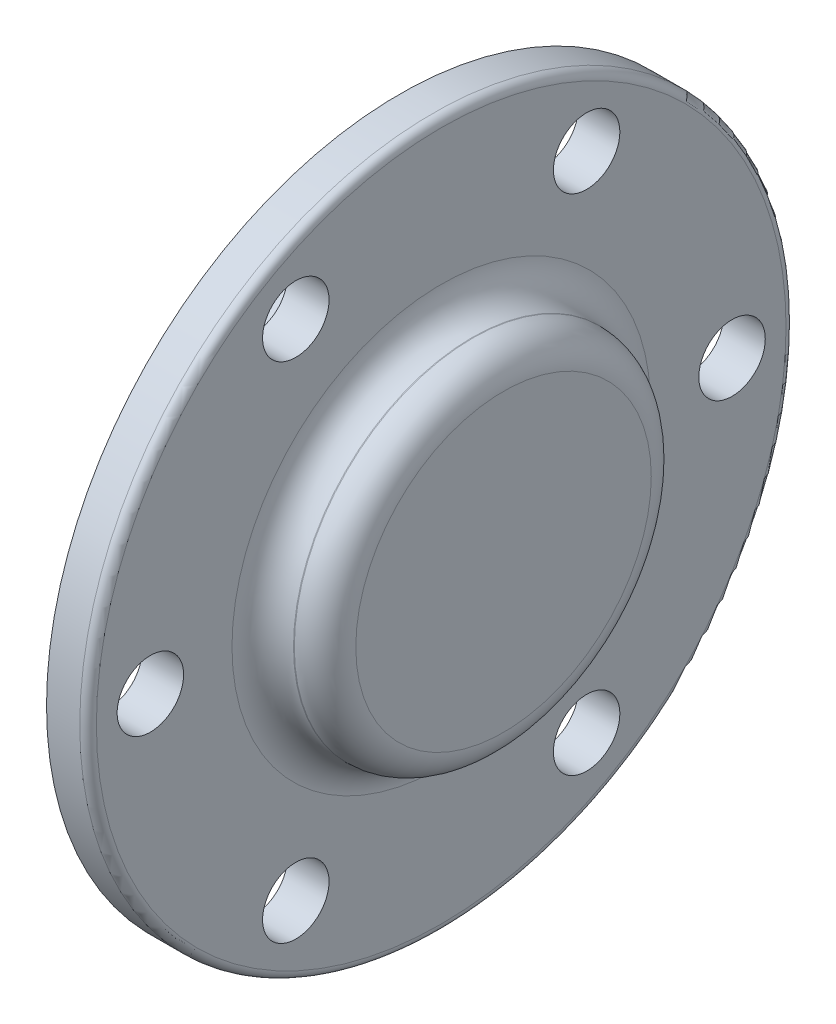
ISO-10303-21;
HEADER;
FILE_DESCRIPTION(('STEP AP214'),'2;1');
FILE_NAME('part.step','',(''),(''),'','','');
FILE_SCHEMA(('AUTOMOTIVE_DESIGN { 1 0 10303 214 1 1 1 1 }'));
ENDSEC;
DATA;
#1=APPLICATION_CONTEXT('core data for automotive mechanical design processes');
#2=APPLICATION_PROTOCOL_DEFINITION('international standard','automotive_design',2000,#1);
#3=PRODUCT_CONTEXT('',#1,'mechanical');
#4=PRODUCT('Part','Part','',(#3));
#5=PRODUCT_RELATED_PRODUCT_CATEGORY('part','',(#4));
#6=PRODUCT_DEFINITION_FORMATION('','',#4);
#7=PRODUCT_DEFINITION_CONTEXT('part definition',#1,'design');
#8=PRODUCT_DEFINITION('design','',#6,#7);
#9=PRODUCT_DEFINITION_SHAPE('','',#8);
#10=(LENGTH_UNIT() NAMED_UNIT(*) SI_UNIT(.MILLI.,.METRE.));
#11=(NAMED_UNIT(*) PLANE_ANGLE_UNIT() SI_UNIT($,.RADIAN.));
#12=(NAMED_UNIT(*) SI_UNIT($,.STERADIAN.) SOLID_ANGLE_UNIT());
#13=UNCERTAINTY_MEASURE_WITH_UNIT(LENGTH_MEASURE(1.E-05),#10,'distance_accuracy_value','');
#14=(GEOMETRIC_REPRESENTATION_CONTEXT(3) GLOBAL_UNCERTAINTY_ASSIGNED_CONTEXT((#13)) GLOBAL_UNIT_ASSIGNED_CONTEXT((#10,
#11,#12)) REPRESENTATION_CONTEXT('',''));
#15=CARTESIAN_POINT('',(0.,0.,0.));
#16=DIRECTION('',(0.,0.,1.));
#17=DIRECTION('',(1.,0.,0.));
#18=AXIS2_PLACEMENT_3D('',#15,#16,#17);
#19=CARTESIAN_POINT('',(38.,0.,0.));
#20=DIRECTION('',(1.,0.,0.));
#21=DIRECTION('',(0.,0.,-1.));
#22=AXIS2_PLACEMENT_3D('',#19,#20,#21);
#23=PLANE('',#22);
#24=CARTESIAN_POINT('',(38.,0.,0.));
#25=DIRECTION('',(-1.,0.,0.));
#26=DIRECTION('',(0.,0.,1.));
#27=AXIS2_PLACEMENT_3D('',#24,#25,#26);
#28=CIRCLE('',#27,23.139710976573);
#29=CARTESIAN_POINT('',(38.,0.,23.139710976573));
#30=VERTEX_POINT('',#29);
#31=EDGE_CURVE('E70',#30,#30,#28,.T.);
#32=ORIENTED_EDGE('',*,*,#31,.T.);
#33=EDGE_LOOP('',(#32));
#34=FACE_BOUND('',#33,.T.);
#35=ADVANCED_FACE('F37',(#34),#23,.F.);
#36=CARTESIAN_POINT('',(48.,0.,0.));
#37=DIRECTION('',(1.,0.,0.));
#38=DIRECTION('',(0.,0.,-1.));
#39=AXIS2_PLACEMENT_3D('',#36,#37,#38);
#40=PLANE('',#39);
#41=CARTESIAN_POINT('',(48.,0.,0.));
#42=DIRECTION('',(-1.,0.,0.));
#43=DIRECTION('',(0.,0.,1.));
#44=AXIS2_PLACEMENT_3D('',#41,#42,#43);
#45=CIRCLE('',#44,35.5600663113483);
#46=CARTESIAN_POINT('',(48.,0.,35.5600663113483));
#47=VERTEX_POINT('',#46);
#48=EDGE_CURVE('E10',#47,#47,#45,.T.);
#49=ORIENTED_EDGE('',*,*,#48,.F.);
#50=EDGE_LOOP('',(#49));
#51=FACE_BOUND('',#50,.T.);
#52=ADVANCED_FACE('F121',(#51),#40,.T.);
#53=CARTESIAN_POINT('',(40.6,0.,0.));
#54=DIRECTION('',(-1.,0.,0.));
#55=DIRECTION('',(0.,0.,1.));
#56=AXIS2_PLACEMENT_3D('',#53,#54,#55);
#57=TOROIDAL_SURFACE('',#56,35.5600663113483,7.4);
#58=ORIENTED_EDGE('',*,*,#48,.T.);
#59=EDGE_LOOP('',(#58));
#60=FACE_BOUND('',#59,.T.);
#61=CARTESIAN_POINT('',(40.6,0.,0.));
#62=DIRECTION('',(-1.,0.,0.));
#63=DIRECTION('',(0.,0.,1.));
#64=AXIS2_PLACEMENT_3D('',#61,#62,#63);
#65=CIRCLE('',#64,42.9600663113483);
#66=CARTESIAN_POINT('',(40.6,0.,42.9600663113483));
#67=VERTEX_POINT('',#66);
#68=EDGE_CURVE('E44',#67,#67,#65,.T.);
#69=ORIENTED_EDGE('',*,*,#68,.F.);
#70=EDGE_LOOP('',(#69));
#71=FACE_BOUND('',#70,.T.);
#72=ADVANCED_FACE('F112',(#60,#71),#57,.T.);
#73=CARTESIAN_POINT('',(0.,0.,0.));
#74=DIRECTION('',(-1.,0.,0.));
#75=DIRECTION('',(0.,0.,1.));
#76=AXIS2_PLACEMENT_3D('',#73,#74,#75);
#77=CYLINDRICAL_SURFACE('',#76,42.9600663113483);
#78=ORIENTED_EDGE('',*,*,#68,.T.);
#79=EDGE_LOOP('',(#78));
#80=FACE_BOUND('',#79,.T.);
#81=CARTESIAN_POINT('',(40.4,0.,0.));
#82=DIRECTION('',(-1.,0.,0.));
#83=DIRECTION('',(0.,0.,1.));
#84=AXIS2_PLACEMENT_3D('',#81,#82,#83);
#85=CIRCLE('',#84,42.9600663113483);
#86=CARTESIAN_POINT('',(40.4,0.,42.9600663113483));
#87=VERTEX_POINT('',#86);
#88=EDGE_CURVE('E49',#87,#87,#85,.T.);
#89=ORIENTED_EDGE('',*,*,#88,.F.);
#90=EDGE_LOOP('',(#89));
#91=FACE_BOUND('',#90,.T.);
#92=ADVANCED_FACE('F110',(#80,#91),#77,.T.);
#93=CARTESIAN_POINT('',(40.4,0.,0.));
#94=DIRECTION('',(-1.,0.,0.));
#95=DIRECTION('',(0.,0.,1.));
#96=AXIS2_PLACEMENT_3D('',#93,#94,#95);
#97=TOROIDAL_SURFACE('',#96,50.3600663113483,7.40000000000001);
#98=ORIENTED_EDGE('',*,*,#88,.T.);
#99=EDGE_LOOP('',(#98));
#100=FACE_BOUND('',#99,.T.);
#101=CARTESIAN_POINT('',(33.,0.,0.));
#102=DIRECTION('',(-1.,0.,0.));
#103=DIRECTION('',(0.,0.,1.));
#104=AXIS2_PLACEMENT_3D('',#101,#102,#103);
#105=CIRCLE('',#104,50.3600663113483);
#106=CARTESIAN_POINT('',(33.,0.,50.3600663113483));
#107=VERTEX_POINT('',#106);
#108=EDGE_CURVE('E102',#107,#107,#105,.T.);
#109=ORIENTED_EDGE('',*,*,#108,.F.);
#110=EDGE_LOOP('',(#109));
#111=FACE_BOUND('',#110,.T.);
#112=ADVANCED_FACE('F107',(#100,#111),#97,.F.);
#113=CARTESIAN_POINT('',(33.,0.,0.));
#114=DIRECTION('',(1.,0.,0.));
#115=DIRECTION('',(0.,0.,-1.));
#116=AXIS2_PLACEMENT_3D('',#113,#114,#115);
#117=PLANE('',#116);
#118=CARTESIAN_POINT('',(33.,0.,-70.));
#119=DIRECTION('',(1.,0.,0.));
#120=DIRECTION('',(0.,0.,-1.));
#121=AXIS2_PLACEMENT_3D('',#118,#119,#120);
#122=CIRCLE('',#121,8.);
#123=CARTESIAN_POINT('',(33.,0.,-78.));
#124=VERTEX_POINT('',#123);
#125=EDGE_CURVE('E57',#124,#124,#122,.T.);
#126=ORIENTED_EDGE('',*,*,#125,.F.);
#127=EDGE_LOOP('',(#126));
#128=FACE_BOUND('',#127,.T.);
#129=CARTESIAN_POINT('',(33.,60.6217782649107,-35.));
#130=DIRECTION('',(1.,0.,0.));
#131=DIRECTION('',(0.,0.,-1.));
#132=AXIS2_PLACEMENT_3D('',#129,#130,#131);
#133=CIRCLE('',#132,7.99999999999998);
#134=CARTESIAN_POINT('',(33.,60.6217782649107,-43.));
#135=VERTEX_POINT('',#134);
#136=EDGE_CURVE('E338',#135,#135,#133,.T.);
#137=ORIENTED_EDGE('',*,*,#136,.F.);
#138=EDGE_LOOP('',(#137));
#139=FACE_BOUND('',#138,.T.);
#140=CARTESIAN_POINT('',(33.,60.6217782649107,35.));
#141=DIRECTION('',(1.,0.,0.));
#142=DIRECTION('',(0.,0.,-1.));
#143=AXIS2_PLACEMENT_3D('',#140,#141,#142);
#144=CIRCLE('',#143,7.99999999999999);
#145=CARTESIAN_POINT('',(33.,60.6217782649107,27.));
#146=VERTEX_POINT('',#145);
#147=EDGE_CURVE('E82',#146,#146,#144,.T.);
#148=ORIENTED_EDGE('',*,*,#147,.F.);
#149=EDGE_LOOP('',(#148));
#150=FACE_BOUND('',#149,.T.);
#151=CARTESIAN_POINT('',(33.,0.,70.));
#152=DIRECTION('',(1.,0.,0.));
#153=DIRECTION('',(0.,0.,-1.));
#154=AXIS2_PLACEMENT_3D('',#151,#152,#153);
#155=CIRCLE('',#154,7.99999999999999);
#156=CARTESIAN_POINT('',(33.,0.,62.));
#157=VERTEX_POINT('',#156);
#158=EDGE_CURVE('E342',#157,#157,#155,.T.);
#159=ORIENTED_EDGE('',*,*,#158,.F.);
#160=EDGE_LOOP('',(#159));
#161=FACE_BOUND('',#160,.T.);
#162=CARTESIAN_POINT('',(33.,-60.6217782649107,35.));
#163=DIRECTION('',(1.,0.,0.));
#164=DIRECTION('',(0.,0.,-1.));
#165=AXIS2_PLACEMENT_3D('',#162,#163,#164);
#166=CIRCLE('',#165,8.);
#167=CARTESIAN_POINT('',(33.,-60.6217782649107,27.));
#168=VERTEX_POINT('',#167);
#169=EDGE_CURVE('E335',#168,#168,#166,.T.);
#170=ORIENTED_EDGE('',*,*,#169,.F.);
#171=EDGE_LOOP('',(#170));
#172=FACE_BOUND('',#171,.T.);
#173=CARTESIAN_POINT('',(33.,-60.6217782649107,-35.));
#174=DIRECTION('',(1.,0.,0.));
#175=DIRECTION('',(0.,0.,-1.));
#176=AXIS2_PLACEMENT_3D('',#173,#174,#175);
#177=CIRCLE('',#176,8.00000000000001);
#178=CARTESIAN_POINT('',(33.,-60.6217782649107,-43.));
#179=VERTEX_POINT('',#178);
#180=EDGE_CURVE('E332',#179,#179,#177,.T.);
#181=ORIENTED_EDGE('',*,*,#180,.F.);
#182=EDGE_LOOP('',(#181));
#183=FACE_BOUND('',#182,.T.);
#184=ORIENTED_EDGE('',*,*,#108,.T.);
#185=EDGE_LOOP('',(#184));
#186=FACE_BOUND('',#185,.T.);
#187=CARTESIAN_POINT('',(33.,0.,0.));
#188=DIRECTION('',(-1.,0.,0.));
#189=DIRECTION('',(0.,0.,1.));
#190=AXIS2_PLACEMENT_3D('',#187,#188,#189);
#191=CIRCLE('',#190,83.);
#192=CARTESIAN_POINT('',(33.,0.,83.));
#193=VERTEX_POINT('',#192);
#194=EDGE_CURVE('E99',#193,#193,#191,.T.);
#195=ORIENTED_EDGE('',*,*,#194,.F.);
#196=EDGE_LOOP('',(#195));
#197=FACE_BOUND('',#196,.T.);
#198=ADVANCED_FACE('F119',(#128,#139,#150,#161,#172,#183,#186,#197),#117,.T.);
#199=CARTESIAN_POINT('',(31.,0.,0.));
#200=DIRECTION('',(-1.,0.,0.));
#201=DIRECTION('',(0.,0.,1.));
#202=AXIS2_PLACEMENT_3D('',#199,#200,#201);
#203=TOROIDAL_SURFACE('',#202,83.,2.);
#204=ORIENTED_EDGE('',*,*,#194,.T.);
#205=EDGE_LOOP('',(#204));
#206=FACE_BOUND('',#205,.T.);
#207=CARTESIAN_POINT('',(31.,0.,0.));
#208=DIRECTION('',(-1.,0.,0.));
#209=DIRECTION('',(0.,0.,1.));
#210=AXIS2_PLACEMENT_3D('',#207,#208,#209);
#211=CIRCLE('',#210,85.);
#212=CARTESIAN_POINT('',(31.,0.,85.));
#213=VERTEX_POINT('',#212);
#214=EDGE_CURVE('E96',#213,#213,#211,.T.);
#215=ORIENTED_EDGE('',*,*,#214,.F.);
#216=EDGE_LOOP('',(#215));
#217=FACE_BOUND('',#216,.T.);
#218=ADVANCED_FACE('F154',(#206,#217),#203,.T.);
#219=CARTESIAN_POINT('',(0.,0.,0.));
#220=DIRECTION('',(-1.,0.,0.));
#221=DIRECTION('',(0.,0.,1.));
#222=AXIS2_PLACEMENT_3D('',#219,#220,#221);
#223=CYLINDRICAL_SURFACE('',#222,85.);
#224=ORIENTED_EDGE('',*,*,#214,.T.);
#225=EDGE_LOOP('',(#224));
#226=FACE_BOUND('',#225,.T.);
#227=CARTESIAN_POINT('',(23.,0.,0.));
#228=DIRECTION('',(-1.,0.,0.));
#229=DIRECTION('',(0.,0.,1.));
#230=AXIS2_PLACEMENT_3D('',#227,#228,#229);
#231=CIRCLE('',#230,85.);
#232=CARTESIAN_POINT('',(23.,0.,85.));
#233=VERTEX_POINT('',#232);
#234=EDGE_CURVE('E93',#233,#233,#231,.T.);
#235=ORIENTED_EDGE('',*,*,#234,.F.);
#236=EDGE_LOOP('',(#235));
#237=FACE_BOUND('',#236,.T.);
#238=ADVANCED_FACE('F159',(#226,#237),#223,.T.);
#239=CARTESIAN_POINT('',(23.,0.,0.));
#240=DIRECTION('',(-1.,0.,0.));
#241=DIRECTION('',(0.,0.,1.));
#242=AXIS2_PLACEMENT_3D('',#239,#240,#241);
#243=PLANE('',#242);
#244=CARTESIAN_POINT('',(23.,0.,-70.));
#245=DIRECTION('',(-1.,0.,0.));
#246=DIRECTION('',(0.,0.,1.));
#247=AXIS2_PLACEMENT_3D('',#244,#245,#246);
#248=CIRCLE('',#247,8.);
#249=CARTESIAN_POINT('',(23.,0.,-62.));
#250=VERTEX_POINT('',#249);
#251=EDGE_CURVE('E40',#250,#250,#248,.T.);
#252=ORIENTED_EDGE('',*,*,#251,.F.);
#253=EDGE_LOOP('',(#252));
#254=FACE_BOUND('',#253,.T.);
#255=CARTESIAN_POINT('',(23.,60.6217782649107,-35.));
#256=DIRECTION('',(-1.,0.,0.));
#257=DIRECTION('',(0.,0.,1.));
#258=AXIS2_PLACEMENT_3D('',#255,#256,#257);
#259=CIRCLE('',#258,7.99999999999998);
#260=CARTESIAN_POINT('',(23.,60.6217782649107,-27.));
#261=VERTEX_POINT('',#260);
#262=EDGE_CURVE('E65',#261,#261,#259,.T.);
#263=ORIENTED_EDGE('',*,*,#262,.F.);
#264=EDGE_LOOP('',(#263));
#265=FACE_BOUND('',#264,.T.);
#266=CARTESIAN_POINT('',(23.,60.6217782649107,35.));
#267=DIRECTION('',(-1.,0.,0.));
#268=DIRECTION('',(0.,0.,1.));
#269=AXIS2_PLACEMENT_3D('',#266,#267,#268);
#270=CIRCLE('',#269,7.99999999999999);
#271=CARTESIAN_POINT('',(23.,60.6217782649107,43.));
#272=VERTEX_POINT('',#271);
#273=EDGE_CURVE('E63',#272,#272,#270,.T.);
#274=ORIENTED_EDGE('',*,*,#273,.F.);
#275=EDGE_LOOP('',(#274));
#276=FACE_BOUND('',#275,.T.);
#277=CARTESIAN_POINT('',(23.,0.,70.));
#278=DIRECTION('',(-1.,0.,0.));
#279=DIRECTION('',(0.,0.,1.));
#280=AXIS2_PLACEMENT_3D('',#277,#278,#279);
#281=CIRCLE('',#280,7.99999999999999);
#282=CARTESIAN_POINT('',(23.,0.,78.));
#283=VERTEX_POINT('',#282);
#284=EDGE_CURVE('E60',#283,#283,#281,.T.);
#285=ORIENTED_EDGE('',*,*,#284,.F.);
#286=EDGE_LOOP('',(#285));
#287=FACE_BOUND('',#286,.T.);
#288=CARTESIAN_POINT('',(23.,-60.6217782649107,35.));
#289=DIRECTION('',(-1.,0.,0.));
#290=DIRECTION('',(0.,0.,1.));
#291=AXIS2_PLACEMENT_3D('',#288,#289,#290);
#292=CIRCLE('',#291,8.);
#293=CARTESIAN_POINT('',(23.,-60.6217782649107,43.));
#294=VERTEX_POINT('',#293);
#295=EDGE_CURVE('E56',#294,#294,#292,.T.);
#296=ORIENTED_EDGE('',*,*,#295,.F.);
#297=EDGE_LOOP('',(#296));
#298=FACE_BOUND('',#297,.T.);
#299=CARTESIAN_POINT('',(23.,-60.6217782649107,-35.));
#300=DIRECTION('',(-1.,0.,0.));
#301=DIRECTION('',(0.,0.,1.));
#302=AXIS2_PLACEMENT_3D('',#299,#300,#301);
#303=CIRCLE('',#302,8.00000000000001);
#304=CARTESIAN_POINT('',(23.,-60.6217782649107,-27.));
#305=VERTEX_POINT('',#304);
#306=EDGE_CURVE('E53',#305,#305,#303,.T.);
#307=ORIENTED_EDGE('',*,*,#306,.F.);
#308=EDGE_LOOP('',(#307));
#309=FACE_BOUND('',#308,.T.);
#310=ORIENTED_EDGE('',*,*,#234,.T.);
#311=EDGE_LOOP('',(#310));
#312=FACE_BOUND('',#311,.T.);
#313=CARTESIAN_POINT('',(23.,0.,0.));
#314=DIRECTION('',(-1.,0.,0.));
#315=DIRECTION('',(0.,0.,1.));
#316=AXIS2_PLACEMENT_3D('',#313,#314,#315);
#317=CIRCLE('',#316,45.);
#318=CARTESIAN_POINT('',(23.,0.,45.));
#319=VERTEX_POINT('',#318);
#320=EDGE_CURVE('E90',#319,#319,#317,.T.);
#321=ORIENTED_EDGE('',*,*,#320,.F.);
#322=EDGE_LOOP('',(#321));
#323=FACE_BOUND('',#322,.T.);
#324=ADVANCED_FACE('F170',(#254,#265,#276,#287,#298,#309,#312,#323),#243,.T.);
#325=CARTESIAN_POINT('',(0.,0.,0.));
#326=DIRECTION('',(-1.,0.,0.));
#327=DIRECTION('',(0.,0.,1.));
#328=AXIS2_PLACEMENT_3D('',#325,#326,#327);
#329=CYLINDRICAL_SURFACE('',#328,45.);
#330=ORIENTED_EDGE('',*,*,#320,.T.);
#331=EDGE_LOOP('',(#330));
#332=FACE_BOUND('',#331,.T.);
#333=CARTESIAN_POINT('',(0.,0.,0.));
#334=DIRECTION('',(-1.,0.,0.));
#335=DIRECTION('',(0.,0.,1.));
#336=AXIS2_PLACEMENT_3D('',#333,#334,#335);
#337=CIRCLE('',#336,45.);
#338=CARTESIAN_POINT('',(0.,0.,45.));
#339=VERTEX_POINT('',#338);
#340=EDGE_CURVE('E87',#339,#339,#337,.T.);
#341=ORIENTED_EDGE('',*,*,#340,.F.);
#342=EDGE_LOOP('',(#341));
#343=FACE_BOUND('',#342,.T.);
#344=ADVANCED_FACE('F179',(#332,#343),#329,.T.);
#345=CARTESIAN_POINT('',(0.,0.,0.));
#346=DIRECTION('',(-1.,0.,0.));
#347=DIRECTION('',(0.,0.,1.));
#348=AXIS2_PLACEMENT_3D('',#345,#346,#347);
#349=PLANE('',#348);
#350=ORIENTED_EDGE('',*,*,#340,.T.);
#351=EDGE_LOOP('',(#350));
#352=FACE_BOUND('',#351,.T.);
#353=CARTESIAN_POINT('',(0.,0.,0.));
#354=DIRECTION('',(-1.,0.,0.));
#355=DIRECTION('',(0.,0.,1.));
#356=AXIS2_PLACEMENT_3D('',#353,#354,#355);
#357=CIRCLE('',#356,39.);
#358=CARTESIAN_POINT('',(0.,0.,39.));
#359=VERTEX_POINT('',#358);
#360=EDGE_CURVE('E79',#359,#359,#357,.T.);
#361=ORIENTED_EDGE('',*,*,#360,.F.);
#362=EDGE_LOOP('',(#361));
#363=FACE_BOUND('',#362,.T.);
#364=ADVANCED_FACE('F184',(#352,#363),#349,.T.);
#365=CARTESIAN_POINT('',(0.,0.,0.));
#366=DIRECTION('',(-1.,0.,0.));
#367=DIRECTION('',(0.,0.,1.));
#368=AXIS2_PLACEMENT_3D('',#365,#366,#367);
#369=CONICAL_SURFACE('',#368,39.,0.26179938779915);
#370=CARTESIAN_POINT('',(32.5152609337587,0.,0.));
#371=DIRECTION('',(-1.,0.,0.));
#372=DIRECTION('',(0.,0.,1.));
#373=AXIS2_PLACEMENT_3D('',#370,#371,#372);
#374=CIRCLE('',#373,30.2875620911121);
#375=CARTESIAN_POINT('',(32.5152609337587,0.,30.2875620911121));
#376=VERTEX_POINT('',#375);
#377=EDGE_CURVE('E74',#376,#376,#374,.T.);
#378=ORIENTED_EDGE('',*,*,#377,.F.);
#379=EDGE_LOOP('',(#378));
#380=FACE_BOUND('',#379,.T.);
#381=ORIENTED_EDGE('',*,*,#360,.T.);
#382=EDGE_LOOP('',(#381));
#383=FACE_BOUND('',#382,.T.);
#384=ADVANCED_FACE('F195',(#380,#383),#369,.F.);
#385=CARTESIAN_POINT('',(30.6,0.,0.));
#386=DIRECTION('',(-1.,0.,0.));
#387=DIRECTION('',(0.,0.,1.));
#388=AXIS2_PLACEMENT_3D('',#385,#386,#387);
#389=TOROIDAL_SURFACE('',#388,23.139710976573,7.40000000000001);
#390=ORIENTED_EDGE('',*,*,#31,.F.);
#391=EDGE_LOOP('',(#390));
#392=FACE_BOUND('',#391,.T.);
#393=ORIENTED_EDGE('',*,*,#377,.T.);
#394=EDGE_LOOP('',(#393));
#395=FACE_BOUND('',#394,.T.);
#396=ADVANCED_FACE('F206',(#392,#395),#389,.F.);
#397=CARTESIAN_POINT('',(0.,-60.6217782649107,-35.));
#398=DIRECTION('',(1.,0.,0.));
#399=DIRECTION('',(0.,0.,-1.));
#400=AXIS2_PLACEMENT_3D('',#397,#398,#399);
#401=CYLINDRICAL_SURFACE('',#400,8.00000000000001);
#402=ORIENTED_EDGE('',*,*,#306,.T.);
#403=EDGE_LOOP('',(#402));
#404=FACE_BOUND('',#403,.T.);
#405=ORIENTED_EDGE('',*,*,#180,.T.);
#406=EDGE_LOOP('',(#405));
#407=FACE_BOUND('',#406,.T.);
#408=ADVANCED_FACE('F217',(#404,#407),#401,.F.);
#409=CARTESIAN_POINT('',(0.,-60.6217782649107,35.));
#410=DIRECTION('',(1.,0.,0.));
#411=DIRECTION('',(0.,0.,-1.));
#412=AXIS2_PLACEMENT_3D('',#409,#410,#411);
#413=CYLINDRICAL_SURFACE('',#412,8.);
#414=ORIENTED_EDGE('',*,*,#295,.T.);
#415=EDGE_LOOP('',(#414));
#416=FACE_BOUND('',#415,.T.);
#417=ORIENTED_EDGE('',*,*,#169,.T.);
#418=EDGE_LOOP('',(#417));
#419=FACE_BOUND('',#418,.T.);
#420=ADVANCED_FACE('F238',(#416,#419),#413,.F.);
#421=CARTESIAN_POINT('',(0.,0.,70.));
#422=DIRECTION('',(1.,0.,0.));
#423=DIRECTION('',(0.,0.,-1.));
#424=AXIS2_PLACEMENT_3D('',#421,#422,#423);
#425=CYLINDRICAL_SURFACE('',#424,7.99999999999999);
#426=ORIENTED_EDGE('',*,*,#284,.T.);
#427=EDGE_LOOP('',(#426));
#428=FACE_BOUND('',#427,.T.);
#429=ORIENTED_EDGE('',*,*,#158,.T.);
#430=EDGE_LOOP('',(#429));
#431=FACE_BOUND('',#430,.T.);
#432=ADVANCED_FACE('F249',(#428,#431),#425,.F.);
#433=CARTESIAN_POINT('',(0.,60.6217782649107,35.));
#434=DIRECTION('',(1.,0.,0.));
#435=DIRECTION('',(0.,0.,-1.));
#436=AXIS2_PLACEMENT_3D('',#433,#434,#435);
#437=CYLINDRICAL_SURFACE('',#436,7.99999999999999);
#438=ORIENTED_EDGE('',*,*,#273,.T.);
#439=EDGE_LOOP('',(#438));
#440=FACE_BOUND('',#439,.T.);
#441=ORIENTED_EDGE('',*,*,#147,.T.);
#442=EDGE_LOOP('',(#441));
#443=FACE_BOUND('',#442,.T.);
#444=ADVANCED_FACE('F260',(#440,#443),#437,.F.);
#445=CARTESIAN_POINT('',(0.,60.6217782649107,-35.));
#446=DIRECTION('',(1.,0.,0.));
#447=DIRECTION('',(0.,0.,-1.));
#448=AXIS2_PLACEMENT_3D('',#445,#446,#447);
#449=CYLINDRICAL_SURFACE('',#448,7.99999999999998);
#450=ORIENTED_EDGE('',*,*,#262,.T.);
#451=EDGE_LOOP('',(#450));
#452=FACE_BOUND('',#451,.T.);
#453=ORIENTED_EDGE('',*,*,#136,.T.);
#454=EDGE_LOOP('',(#453));
#455=FACE_BOUND('',#454,.T.);
#456=ADVANCED_FACE('F271',(#452,#455),#449,.F.);
#457=CARTESIAN_POINT('',(0.,0.,-70.));
#458=DIRECTION('',(1.,0.,0.));
#459=DIRECTION('',(0.,0.,-1.));
#460=AXIS2_PLACEMENT_3D('',#457,#458,#459);
#461=CYLINDRICAL_SURFACE('',#460,8.);
#462=ORIENTED_EDGE('',*,*,#251,.T.);
#463=EDGE_LOOP('',(#462));
#464=FACE_BOUND('',#463,.T.);
#465=ORIENTED_EDGE('',*,*,#125,.T.);
#466=EDGE_LOOP('',(#465));
#467=FACE_BOUND('',#466,.T.);
#468=ADVANCED_FACE('F282',(#464,#467),#461,.F.);
#469=CLOSED_SHELL('',(#35,#52,#72,#92,#112,#198,#218,#238,#324,#344,#364,#384,#396,#408,#420,
#432,#444,#456,#468));
#470=MANIFOLD_SOLID_BREP('B2',#469);
#471=ADVANCED_BREP_SHAPE_REPRESENTATION('',(#18,#470),#14);
#472=SHAPE_DEFINITION_REPRESENTATION(#9,#471);
ENDSEC;
END-ISO-10303-21;
